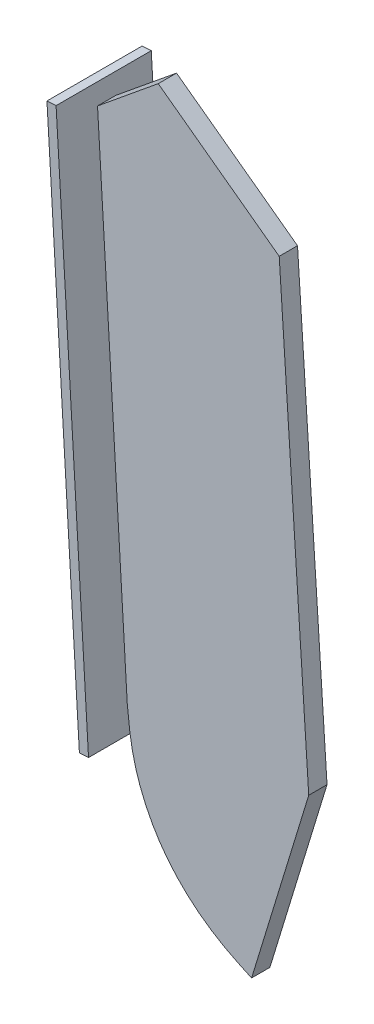
ISO-10303-21;
HEADER;
FILE_DESCRIPTION(('STEP AP214'),'2;1');
FILE_NAME('part.step','',(''),(''),'','','');
FILE_SCHEMA(('AUTOMOTIVE_DESIGN { 1 0 10303 214 1 1 1 1 }'));
ENDSEC;
DATA;
#1=APPLICATION_CONTEXT('core data for automotive mechanical design processes');
#2=APPLICATION_PROTOCOL_DEFINITION('international standard','automotive_design',2000,#1);
#3=PRODUCT_CONTEXT('',#1,'mechanical');
#4=PRODUCT('Part','Part','',(#3));
#5=PRODUCT_RELATED_PRODUCT_CATEGORY('part','',(#4));
#6=PRODUCT_DEFINITION_FORMATION('','',#4);
#7=PRODUCT_DEFINITION_CONTEXT('part definition',#1,'design');
#8=PRODUCT_DEFINITION('design','',#6,#7);
#9=PRODUCT_DEFINITION_SHAPE('','',#8);
#10=(LENGTH_UNIT() NAMED_UNIT(*) SI_UNIT(.MILLI.,.METRE.));
#11=(NAMED_UNIT(*) PLANE_ANGLE_UNIT() SI_UNIT($,.RADIAN.));
#12=(NAMED_UNIT(*) SI_UNIT($,.STERADIAN.) SOLID_ANGLE_UNIT());
#13=UNCERTAINTY_MEASURE_WITH_UNIT(LENGTH_MEASURE(1.E-05),#10,'distance_accuracy_value','');
#14=(GEOMETRIC_REPRESENTATION_CONTEXT(3) GLOBAL_UNCERTAINTY_ASSIGNED_CONTEXT((#13)) GLOBAL_UNIT_ASSIGNED_CONTEXT((#10,
#11,#12)) REPRESENTATION_CONTEXT('',''));
#15=CARTESIAN_POINT('',(0.,0.,0.));
#16=DIRECTION('',(0.,0.,1.));
#17=DIRECTION('',(1.,0.,0.));
#18=AXIS2_PLACEMENT_3D('',#15,#16,#17);
#19=CARTESIAN_POINT('',(-2.99435814981215,-19.6340977838939,0.));
#20=DIRECTION('',(0.,0.,-1.));
#21=DIRECTION('',(-1.,0.,0.));
#22=AXIS2_PLACEMENT_3D('',#19,#20,#21);
#23=PLANE('',#22);
#24=DIRECTION('',(-0.0651979869605493,0.997872347796196,0.));
#25=VECTOR('',#24,1.);
#26=CARTESIAN_POINT('',(7.4080262637328,-18.9544371791575,0.));
#27=LINE('',#26,#25);
#28=CARTESIAN_POINT('',(6.92839376128696,-11.6135355101443,0.));
#29=VERTEX_POINT('',#28);
#30=CARTESIAN_POINT('',(4.99186782849453,18.0255035033314,0.));
#31=VERTEX_POINT('',#30);
#32=EDGE_CURVE('E220',#29,#31,#27,.T.);
#33=ORIENTED_EDGE('',*,*,#32,.F.);
#34=DIRECTION('',(0.292562627041401,0.956246364311329,0.));
#35=VECTOR('',#34,1.);
#36=CARTESIAN_POINT('',(3.8352286118043,-21.7236030820653,0.));
#37=LINE('',#36,#35);
#38=CARTESIAN_POINT('',(3.18015089677821,-23.8647367247269,0.));
#39=VERTEX_POINT('',#38);
#40=EDGE_CURVE('E111',#39,#29,#37,.T.);
#41=ORIENTED_EDGE('',*,*,#40,.F.);
#42=CARTESIAN_POINT('',(-4.97116371564079,-12.3677248434994,0.));
#43=CARTESIAN_POINT('',(-4.9104375920772,-12.986836228571,0.));
#44=CARTESIAN_POINT('',(-4.84967635702795,-13.6059395744976,0.));
#45=CARTESIAN_POINT('',(-4.65454308470152,-14.8272922966131,0.));
#46=CARTESIAN_POINT('',(-4.51801963225564,-15.4290490836025,0.));
#47=CARTESIAN_POINT('',(-4.24283567984022,-16.3155657221554,0.));
#48=CARTESIAN_POINT('',(-4.13915247592688,-16.608333994649,0.));
#49=CARTESIAN_POINT('',(-3.90784814403894,-17.1883896993858,0.));
#50=CARTESIAN_POINT('',(-3.77968372045191,-17.4767605739973,0.));
#51=CARTESIAN_POINT('',(-3.36668629609098,-18.3195399433257,0.));
#52=CARTESIAN_POINT('',(-3.05308792911144,-18.8558737673814,0.));
#53=CARTESIAN_POINT('',(-2.51746792240328,-19.6168793641514,0.));
#54=CARTESIAN_POINT('',(-2.32792866814389,-19.8632127847505,0.));
#55=CARTESIAN_POINT('',(-1.92767848576151,-20.3417607939189,0.));
#56=CARTESIAN_POINT('',(-1.71616765927802,-20.574779067874,0.));
#57=CARTESIAN_POINT('',(-1.05611439654267,-21.2471663901214,0.));
#58=CARTESIAN_POINT('',(-0.586382585309418,-21.6563011055751,0.));
#59=CARTESIAN_POINT('',(0.408094082919773,-22.4020934042176,0.));
#60=CARTESIAN_POINT('',(0.932873324828329,-22.7387056868815,0.));
#61=CARTESIAN_POINT('',(2.03702114271439,-23.3400113404184,0.));
#62=CARTESIAN_POINT('',(2.60865316433103,-23.602856811538,0.));
#63=CARTESIAN_POINT('',(3.18015089677872,-23.8647367247259,0.));
#64=B_SPLINE_CURVE_WITH_KNOTS('',3,(#42,#43,#44,#45,#46,#47,#48,#49,#50,#51,#52,#53,#54,#55,#56,
#57,#58,#59,#60,#61,#62,#63),.UNSPECIFIED.,.F.,.F.,(4,2,2,2,2,2,2,2,2,2,4),(0.,0.125,
0.249999999999999,0.312499999999999,0.375,0.5,0.5625,0.625,0.75,0.875,1.),.UNSPECIFIED.);
#65=CARTESIAN_POINT('',(-4.97116371564079,-12.3677248434994,0.));
#66=VERTEX_POINT('',#65);
#67=EDGE_CURVE('E233',#66,#39,#64,.T.);
#68=ORIENTED_EDGE('',*,*,#67,.F.);
#69=DIRECTION('',(0.0590303717234865,-0.998256187165493,0.));
#70=VECTOR('',#69,1.);
#71=CARTESIAN_POINT('',(-4.53608665860386,-19.7252655704208,0.));
#72=LINE('',#71,#70);
#73=CARTESIAN_POINT('',(-6.92095921815762,20.6050545455971,0.));
#74=VERTEX_POINT('',#73);
#75=EDGE_CURVE('E230',#74,#66,#72,.T.);
#76=ORIENTED_EDGE('',*,*,#75,.F.);
#77=DIRECTION('',(-0.773957299203321,-0.633237790257262,0.));
#78=VECTOR('',#77,1.);
#79=CARTESIAN_POINT('',(-24.290055016919,6.3939761647923,0.));
#80=LINE('',#79,#78);
#81=CARTESIAN_POINT('',(-2.93916536746227,23.8628858779842,0.));
#82=VERTEX_POINT('',#81);
#83=EDGE_CURVE('E227',#82,#74,#80,.T.);
#84=ORIENTED_EDGE('',*,*,#83,.F.);
#85=DIRECTION('',(-0.805372723140072,0.59276873806059,0.));
#86=VECTOR('',#85,1.);
#87=CARTESIAN_POINT('',(17.7904853178753,8.60549197311605,0.));
#88=LINE('',#87,#86);
#89=EDGE_CURVE('E224',#31,#82,#88,.T.);
#90=ORIENTED_EDGE('',*,*,#89,.F.);
#91=EDGE_LOOP('',(#33,#41,#68,#76,#84,#90));
#92=FACE_BOUND('',#91,.T.);
#93=ADVANCED_FACE('F87',(#92),#23,.T.);
#94=CARTESIAN_POINT('',(3.8352286118043,-21.7236030820653,0.));
#95=DIRECTION('',(0.956246364311329,-0.292562627041401,0.));
#96=DIRECTION('',(0.292562627041401,0.956246364311329,0.));
#97=AXIS2_PLACEMENT_3D('',#94,#95,#96);
#98=PLANE('',#97);
#99=DIRECTION('',(0.292562627041401,0.956246364311329,0.));
#100=VECTOR('',#99,1.);
#101=CARTESIAN_POINT('',(3.8352286118043,-21.7236030820653,1.2));
#102=LINE('',#101,#100);
#103=CARTESIAN_POINT('',(3.18015089677821,-23.8647367247269,1.2));
#104=VERTEX_POINT('',#103);
#105=CARTESIAN_POINT('',(6.92839376128696,-11.6135355101443,1.2));
#106=VERTEX_POINT('',#105);
#107=EDGE_CURVE('E216',#104,#106,#102,.T.);
#108=ORIENTED_EDGE('',*,*,#107,.F.);
#109=DIRECTION('',(0.,0.,1.));
#110=VECTOR('',#109,1.);
#111=CARTESIAN_POINT('',(3.18015089677821,-23.8647367247269,0.));
#112=LINE('',#111,#110);
#113=EDGE_CURVE('E12',#39,#104,#112,.T.);
#114=ORIENTED_EDGE('',*,*,#113,.F.);
#115=ORIENTED_EDGE('',*,*,#40,.T.);
#116=DIRECTION('',(0.,0.,1.));
#117=VECTOR('',#116,1.);
#118=CARTESIAN_POINT('',(6.92839376128696,-11.6135355101443,0.));
#119=LINE('',#118,#117);
#120=EDGE_CURVE('E90',#29,#106,#119,.T.);
#121=ORIENTED_EDGE('',*,*,#120,.T.);
#122=EDGE_LOOP('',(#108,#114,#115,#121));
#123=FACE_BOUND('',#122,.T.);
#124=ADVANCED_FACE('F249',(#123),#98,.T.);
#125=DIRECTION('',(0.,0.,1.));
#126=VECTOR('',#125,1.);
#127=SURFACE_OF_LINEAR_EXTRUSION('',#64,#126);
#128=CARTESIAN_POINT('',(-4.97116371564079,-12.3677248434994,1.2));
#129=CARTESIAN_POINT('',(-4.9104375920772,-12.986836228571,1.2));
#130=CARTESIAN_POINT('',(-4.84967635702795,-13.6059395744976,1.2));
#131=CARTESIAN_POINT('',(-4.65454308470152,-14.8272922966131,1.2));
#132=CARTESIAN_POINT('',(-4.51801963225564,-15.4290490836025,1.2));
#133=CARTESIAN_POINT('',(-4.24283567984022,-16.3155657221554,1.2));
#134=CARTESIAN_POINT('',(-4.13915247592688,-16.608333994649,1.2));
#135=CARTESIAN_POINT('',(-3.90784814403894,-17.1883896993858,1.2));
#136=CARTESIAN_POINT('',(-3.77968372045191,-17.4767605739973,1.2));
#137=CARTESIAN_POINT('',(-3.36668629609098,-18.3195399433257,1.2));
#138=CARTESIAN_POINT('',(-3.05308792911144,-18.8558737673814,1.2));
#139=CARTESIAN_POINT('',(-2.51746792240328,-19.6168793641514,1.2));
#140=CARTESIAN_POINT('',(-2.32792866814389,-19.8632127847505,1.2));
#141=CARTESIAN_POINT('',(-1.92767848576151,-20.3417607939189,1.2));
#142=CARTESIAN_POINT('',(-1.71616765927802,-20.574779067874,1.2));
#143=CARTESIAN_POINT('',(-1.05611439654267,-21.2471663901214,1.2));
#144=CARTESIAN_POINT('',(-0.586382585309418,-21.6563011055751,1.2));
#145=CARTESIAN_POINT('',(0.408094082919773,-22.4020934042176,1.2));
#146=CARTESIAN_POINT('',(0.932873324828329,-22.7387056868815,1.2));
#147=CARTESIAN_POINT('',(2.03702114271439,-23.3400113404184,1.2));
#148=CARTESIAN_POINT('',(2.60865316433103,-23.602856811538,1.2));
#149=CARTESIAN_POINT('',(3.18015089677872,-23.8647367247259,1.2));
#150=B_SPLINE_CURVE_WITH_KNOTS('',3,(#128,#129,#130,#131,#132,#133,#134,#135,#136,#137,#138,
#139,#140,#141,#142,#143,#144,#145,#146,#147,#148,#149),.UNSPECIFIED.,.F.,.F.,(4,2,2,2,2,2,2,2,
2,2,4),(0.,0.125,0.249999999999999,0.312499999999999,0.375,0.5,0.5625,0.625,0.75,0.875,1.),.UNSPECIFIED.);
#151=CARTESIAN_POINT('',(-4.97116371564079,-12.3677248434994,1.2));
#152=VERTEX_POINT('',#151);
#153=EDGE_CURVE('E221',#152,#104,#150,.T.);
#154=ORIENTED_EDGE('',*,*,#153,.F.);
#155=DIRECTION('',(0.,0.,1.));
#156=VECTOR('',#155,1.);
#157=CARTESIAN_POINT('',(-4.97116371564079,-12.3677248434994,0.));
#158=LINE('',#157,#156);
#159=EDGE_CURVE('E95',#66,#152,#158,.T.);
#160=ORIENTED_EDGE('',*,*,#159,.F.);
#161=ORIENTED_EDGE('',*,*,#67,.T.);
#162=ORIENTED_EDGE('',*,*,#113,.T.);
#163=EDGE_LOOP('',(#154,#160,#161,#162));
#164=FACE_BOUND('',#163,.T.);
#165=ADVANCED_FACE('F244',(#164),#127,.T.);
#166=CARTESIAN_POINT('',(-4.53608665860386,-19.7252655704208,0.));
#167=DIRECTION('',(-0.998256187165493,-0.0590303717234865,0.));
#168=DIRECTION('',(0.0590303717234865,-0.998256187165493,0.));
#169=AXIS2_PLACEMENT_3D('',#166,#167,#168);
#170=PLANE('',#169);
#171=CARTESIAN_POINT('',(-5.00837517431666,-11.7384459185649,0.600000000000331));
#172=DIRECTION('',(-0.998256187165493,-0.0590303717234865,0.));
#173=DIRECTION('',(0.0590303717234865,-0.998256187165493,0.));
#174=AXIS2_PLACEMENT_3D('',#171,#172,#173);
#175=CIRCLE('',#174,0.300000000000001);
#176=CARTESIAN_POINT('',(-4.99066606279961,-12.0379227747145,0.600000000000331));
#177=VERTEX_POINT('',#176);
#178=EDGE_CURVE('E192',#177,#177,#175,.T.);
#179=ORIENTED_EDGE('',*,*,#178,.F.);
#180=EDGE_LOOP('',(#179));
#181=FACE_BOUND('',#180,.T.);
#182=CARTESIAN_POINT('',(-5.63409711458562,-1.15693033461065,0.600000000000221));
#183=DIRECTION('',(-0.998256187165493,-0.0590303717234865,0.));
#184=DIRECTION('',(0.0590303717234865,-0.998256187165493,0.));
#185=AXIS2_PLACEMENT_3D('',#182,#183,#184);
#186=CIRCLE('',#185,0.300000000000001);
#187=CARTESIAN_POINT('',(-5.61638800306857,-1.4564071907603,0.600000000000221));
#188=VERTEX_POINT('',#187);
#189=EDGE_CURVE('E201',#188,#188,#186,.T.);
#190=ORIENTED_EDGE('',*,*,#189,.F.);
#191=EDGE_LOOP('',(#190));
#192=FACE_BOUND('',#191,.T.);
#193=CARTESIAN_POINT('',(-6.25981905485457,9.42458524934357,0.60000000000011));
#194=DIRECTION('',(-0.998256187165493,-0.0590303717234865,0.));
#195=DIRECTION('',(0.0590303717234865,-0.998256187165493,0.));
#196=AXIS2_PLACEMENT_3D('',#193,#194,#195);
#197=CIRCLE('',#196,0.300000000000001);
#198=CARTESIAN_POINT('',(-6.24210994333753,9.12510839319392,0.60000000000011));
#199=VERTEX_POINT('',#198);
#200=EDGE_CURVE('E207',#199,#199,#197,.T.);
#201=ORIENTED_EDGE('',*,*,#200,.F.);
#202=EDGE_LOOP('',(#201));
#203=FACE_BOUND('',#202,.T.);
#204=CARTESIAN_POINT('',(-6.88554099512353,20.0061008332978,0.6));
#205=DIRECTION('',(-0.998256187165493,-0.0590303717234865,0.));
#206=DIRECTION('',(0.0590303717234865,-0.998256187165493,0.));
#207=AXIS2_PLACEMENT_3D('',#204,#205,#206);
#208=CIRCLE('',#207,0.300000000000002);
#209=CARTESIAN_POINT('',(-6.86783188360648,19.7066239771481,0.6));
#210=VERTEX_POINT('',#209);
#211=EDGE_CURVE('E210',#210,#210,#208,.T.);
#212=ORIENTED_EDGE('',*,*,#211,.F.);
#213=EDGE_LOOP('',(#212));
#214=FACE_BOUND('',#213,.T.);
#215=DIRECTION('',(0.0590303717234865,-0.998256187165493,0.));
#216=VECTOR('',#215,1.);
#217=CARTESIAN_POINT('',(-4.53608665860386,-19.7252655704208,1.2));
#218=LINE('',#217,#216);
#219=CARTESIAN_POINT('',(-6.92095921815762,20.6050545455971,1.2));
#220=VERTEX_POINT('',#219);
#221=EDGE_CURVE('E300',#220,#152,#218,.T.);
#222=ORIENTED_EDGE('',*,*,#221,.F.);
#223=DIRECTION('',(0.,0.,1.));
#224=VECTOR('',#223,1.);
#225=CARTESIAN_POINT('',(-6.92095921815762,20.6050545455971,0.));
#226=LINE('',#225,#224);
#227=EDGE_CURVE('E291',#74,#220,#226,.T.);
#228=ORIENTED_EDGE('',*,*,#227,.F.);
#229=ORIENTED_EDGE('',*,*,#75,.T.);
#230=ORIENTED_EDGE('',*,*,#159,.T.);
#231=EDGE_LOOP('',(#222,#228,#229,#230));
#232=FACE_BOUND('',#231,.T.);
#233=ADVANCED_FACE('F248',(#181,#192,#203,#214,#232),#170,.T.);
#234=CARTESIAN_POINT('',(-24.290055016919,6.3939761647923,0.));
#235=DIRECTION('',(-0.633237790257262,0.773957299203321,0.));
#236=DIRECTION('',(-0.773957299203321,-0.633237790257262,0.));
#237=AXIS2_PLACEMENT_3D('',#234,#235,#236);
#238=PLANE('',#237);
#239=DIRECTION('',(-0.773957299203321,-0.633237790257262,0.));
#240=VECTOR('',#239,1.);
#241=CARTESIAN_POINT('',(-24.290055016919,6.3939761647923,1.2));
#242=LINE('',#241,#240);
#243=CARTESIAN_POINT('',(-2.93916536746227,23.8628858779842,1.2));
#244=VERTEX_POINT('',#243);
#245=EDGE_CURVE('E306',#244,#220,#242,.T.);
#246=ORIENTED_EDGE('',*,*,#245,.F.);
#247=DIRECTION('',(0.,0.,1.));
#248=VECTOR('',#247,1.);
#249=CARTESIAN_POINT('',(-2.93916536746227,23.8628858779842,0.));
#250=LINE('',#249,#248);
#251=EDGE_CURVE('E290',#82,#244,#250,.T.);
#252=ORIENTED_EDGE('',*,*,#251,.F.);
#253=ORIENTED_EDGE('',*,*,#83,.T.);
#254=ORIENTED_EDGE('',*,*,#227,.T.);
#255=EDGE_LOOP('',(#246,#252,#253,#254));
#256=FACE_BOUND('',#255,.T.);
#257=ADVANCED_FACE('F255',(#256),#238,.T.);
#258=CARTESIAN_POINT('',(17.7904853178753,8.60549197311605,0.));
#259=DIRECTION('',(0.59276873806059,0.805372723140072,0.));
#260=DIRECTION('',(-0.805372723140072,0.59276873806059,0.));
#261=AXIS2_PLACEMENT_3D('',#258,#259,#260);
#262=PLANE('',#261);
#263=DIRECTION('',(-0.805372723140072,0.59276873806059,0.));
#264=VECTOR('',#263,1.);
#265=CARTESIAN_POINT('',(17.7904853178753,8.60549197311605,1.2));
#266=LINE('',#265,#264);
#267=CARTESIAN_POINT('',(4.99186782849453,18.0255035033314,1.2));
#268=VERTEX_POINT('',#267);
#269=EDGE_CURVE('E103',#268,#244,#266,.T.);
#270=ORIENTED_EDGE('',*,*,#269,.F.);
#271=DIRECTION('',(0.,0.,1.));
#272=VECTOR('',#271,1.);
#273=CARTESIAN_POINT('',(4.99186782849453,18.0255035033314,0.));
#274=LINE('',#273,#272);
#275=EDGE_CURVE('E286',#31,#268,#274,.T.);
#276=ORIENTED_EDGE('',*,*,#275,.F.);
#277=ORIENTED_EDGE('',*,*,#89,.T.);
#278=ORIENTED_EDGE('',*,*,#251,.T.);
#279=EDGE_LOOP('',(#270,#276,#277,#278));
#280=FACE_BOUND('',#279,.T.);
#281=ADVANCED_FACE('F259',(#280),#262,.T.);
#282=CARTESIAN_POINT('',(7.4080262637328,-18.9544371791575,0.));
#283=DIRECTION('',(0.997872347796196,0.0651979869605493,0.));
#284=DIRECTION('',(-0.0651979869605494,0.997872347796196,0.));
#285=AXIS2_PLACEMENT_3D('',#282,#283,#284);
#286=PLANE('',#285);
#287=DIRECTION('',(-0.0651979869605493,0.997872347796196,0.));
#288=VECTOR('',#287,1.);
#289=CARTESIAN_POINT('',(7.4080262637328,-18.9544371791575,1.2));
#290=LINE('',#289,#288);
#291=EDGE_CURVE('E288',#106,#268,#290,.T.);
#292=ORIENTED_EDGE('',*,*,#291,.F.);
#293=ORIENTED_EDGE('',*,*,#120,.F.);
#294=ORIENTED_EDGE('',*,*,#32,.T.);
#295=ORIENTED_EDGE('',*,*,#275,.T.);
#296=EDGE_LOOP('',(#292,#293,#294,#295));
#297=FACE_BOUND('',#296,.T.);
#298=ADVANCED_FACE('F263',(#297),#286,.T.);
#299=CARTESIAN_POINT('',(-2.99435814981215,-19.6340977838939,1.2));
#300=DIRECTION('',(0.,0.,-1.));
#301=DIRECTION('',(-1.,0.,0.));
#302=AXIS2_PLACEMENT_3D('',#299,#300,#301);
#303=PLANE('',#302);
#304=ORIENTED_EDGE('',*,*,#107,.T.);
#305=ORIENTED_EDGE('',*,*,#291,.T.);
#306=ORIENTED_EDGE('',*,*,#269,.T.);
#307=ORIENTED_EDGE('',*,*,#245,.T.);
#308=ORIENTED_EDGE('',*,*,#221,.T.);
#309=ORIENTED_EDGE('',*,*,#153,.T.);
#310=EDGE_LOOP('',(#304,#305,#306,#307,#308,#309));
#311=FACE_BOUND('',#310,.T.);
#312=ADVANCED_FACE('F266',(#311),#303,.F.);
#313=CARTESIAN_POINT('',(-7.18501785127318,19.9883917217807,0.6));
#314=DIRECTION('',(0.998256187165493,0.0590303717234865,0.));
#315=DIRECTION('',(-0.0590303717234865,0.998256187165493,0.));
#316=AXIS2_PLACEMENT_3D('',#313,#314,#315);
#317=CYLINDRICAL_SURFACE('',#316,0.300000000000002);
#318=CARTESIAN_POINT('',(-7.18501785127318,19.9883917217807,0.6));
#319=DIRECTION('',(-0.998256187165493,-0.0590303717234865,0.));
#320=DIRECTION('',(0.0590303717234865,-0.998256187165493,0.));
#321=AXIS2_PLACEMENT_3D('',#318,#319,#320);
#322=CIRCLE('',#321,0.300000000000002);
#323=CARTESIAN_POINT('',(-7.16730873975613,19.6889148656311,0.6));
#324=VERTEX_POINT('',#323);
#325=EDGE_CURVE('E213',#324,#324,#322,.T.);
#326=ORIENTED_EDGE('',*,*,#325,.F.);
#327=EDGE_LOOP('',(#326));
#328=FACE_BOUND('',#327,.T.);
#329=ORIENTED_EDGE('',*,*,#211,.T.);
#330=EDGE_LOOP('',(#329));
#331=FACE_BOUND('',#330,.T.);
#332=ADVANCED_FACE('F251',(#328,#331),#317,.T.);
#333=CARTESIAN_POINT('',(-6.55929591100422,9.40687613782652,0.60000000000011));
#334=DIRECTION('',(0.998256187165493,0.0590303717234865,0.));
#335=DIRECTION('',(-0.0590303717234865,0.998256187165493,0.));
#336=AXIS2_PLACEMENT_3D('',#333,#334,#335);
#337=CYLINDRICAL_SURFACE('',#336,0.300000000000001);
#338=CARTESIAN_POINT('',(-6.55929591100422,9.40687613782652,0.60000000000011));
#339=DIRECTION('',(-0.998256187165493,-0.0590303717234865,0.));
#340=DIRECTION('',(0.0590303717234865,-0.998256187165493,0.));
#341=AXIS2_PLACEMENT_3D('',#338,#339,#340);
#342=CIRCLE('',#341,0.300000000000001);
#343=CARTESIAN_POINT('',(-6.54158679948717,9.10739928167687,0.60000000000011));
#344=VERTEX_POINT('',#343);
#345=EDGE_CURVE('E204',#344,#344,#342,.T.);
#346=ORIENTED_EDGE('',*,*,#345,.F.);
#347=EDGE_LOOP('',(#346));
#348=FACE_BOUND('',#347,.T.);
#349=ORIENTED_EDGE('',*,*,#200,.T.);
#350=EDGE_LOOP('',(#349));
#351=FACE_BOUND('',#350,.T.);
#352=ADVANCED_FACE('F274',(#348,#351),#337,.T.);
#353=CARTESIAN_POINT('',(-5.93357397073526,-1.1746394461277,0.600000000000221));
#354=DIRECTION('',(0.998256187165493,0.0590303717234865,0.));
#355=DIRECTION('',(-0.0590303717234865,0.998256187165493,0.));
#356=AXIS2_PLACEMENT_3D('',#353,#354,#355);
#357=CYLINDRICAL_SURFACE('',#356,0.300000000000001);
#358=CARTESIAN_POINT('',(-5.93357397073526,-1.1746394461277,0.600000000000221));
#359=DIRECTION('',(-0.998256187165493,-0.0590303717234865,0.));
#360=DIRECTION('',(0.0590303717234865,-0.998256187165493,0.));
#361=AXIS2_PLACEMENT_3D('',#358,#359,#360);
#362=CIRCLE('',#361,0.300000000000001);
#363=CARTESIAN_POINT('',(-5.91586485921822,-1.47411630227735,0.600000000000221));
#364=VERTEX_POINT('',#363);
#365=EDGE_CURVE('E199',#364,#364,#362,.T.);
#366=ORIENTED_EDGE('',*,*,#365,.F.);
#367=EDGE_LOOP('',(#366));
#368=FACE_BOUND('',#367,.T.);
#369=ORIENTED_EDGE('',*,*,#189,.T.);
#370=EDGE_LOOP('',(#369));
#371=FACE_BOUND('',#370,.T.);
#372=ADVANCED_FACE('F383',(#368,#371),#357,.T.);
#373=CARTESIAN_POINT('',(-5.30785203046631,-11.7561550300819,0.600000000000331));
#374=DIRECTION('',(0.998256187165493,0.0590303717234865,0.));
#375=DIRECTION('',(-0.0590303717234865,0.998256187165493,0.));
#376=AXIS2_PLACEMENT_3D('',#373,#374,#375);
#377=CYLINDRICAL_SURFACE('',#376,0.300000000000001);
#378=CARTESIAN_POINT('',(-5.30785203046631,-11.7561550300819,0.600000000000331));
#379=DIRECTION('',(-0.998256187165493,-0.0590303717234865,0.));
#380=DIRECTION('',(0.0590303717234865,-0.998256187165493,0.));
#381=AXIS2_PLACEMENT_3D('',#378,#379,#380);
#382=CIRCLE('',#381,0.300000000000001);
#383=CARTESIAN_POINT('',(-5.29014291894926,-12.0556318862316,0.600000000000331));
#384=VERTEX_POINT('',#383);
#385=EDGE_CURVE('E189',#384,#384,#382,.T.);
#386=ORIENTED_EDGE('',*,*,#385,.F.);
#387=EDGE_LOOP('',(#386));
#388=FACE_BOUND('',#387,.T.);
#389=ORIENTED_EDGE('',*,*,#178,.T.);
#390=EDGE_LOOP('',(#389));
#391=FACE_BOUND('',#390,.T.);
#392=ADVANCED_FACE('F392',(#388,#391),#377,.T.);
#393=CARTESIAN_POINT('',(-7.88059563298337,21.5869726131407,-2.68467914582603));
#394=DIRECTION('',(0.,0.,1.));
#395=DIRECTION('',(1.,0.,0.));
#396=AXIS2_PLACEMENT_3D('',#393,#394,#395);
#397=PLANE('',#396);
#398=DIRECTION('',(0.0590303717234865,-0.998256187165493,0.));
#399=VECTOR('',#398,1.);
#400=CARTESIAN_POINT('',(-7.28164192068407,21.6223908361748,-2.68467914582603));
#401=LINE('',#400,#399);
#402=CARTESIAN_POINT('',(-7.28164192068407,21.6223908361748,-2.68467914582603));
#403=VERTEX_POINT('',#402);
#404=CARTESIAN_POINT('',(-5.15525097437435,-14.3367748697361,-2.68467914582603));
#405=VERTEX_POINT('',#404);
#406=EDGE_CURVE('E188',#403,#405,#401,.T.);
#407=ORIENTED_EDGE('',*,*,#406,.T.);
#408=DIRECTION('',(0.998256187165493,0.0590303717234865,0.));
#409=VECTOR('',#408,1.);
#410=CARTESIAN_POINT('',(-5.75420468667364,-14.3721930927702,-2.68467914582603));
#411=LINE('',#410,#409);
#412=CARTESIAN_POINT('',(-5.75420468667364,-14.3721930927702,-2.68467914582603));
#413=VERTEX_POINT('',#412);
#414=EDGE_CURVE('E168',#413,#405,#411,.T.);
#415=ORIENTED_EDGE('',*,*,#414,.F.);
#416=DIRECTION('',(0.0590303717234865,-0.998256187165493,0.));
#417=VECTOR('',#416,1.);
#418=CARTESIAN_POINT('',(-7.88059563298337,21.5869726131407,-2.68467914582603));
#419=LINE('',#418,#417);
#420=CARTESIAN_POINT('',(-7.88059563298337,21.5869726131407,-2.68467914582603));
#421=VERTEX_POINT('',#420);
#422=EDGE_CURVE('E175',#421,#413,#419,.T.);
#423=ORIENTED_EDGE('',*,*,#422,.F.);
#424=DIRECTION('',(0.998256187165493,0.0590303717234865,0.));
#425=VECTOR('',#424,1.);
#426=CARTESIAN_POINT('',(-7.88059563298337,21.5869726131407,-2.68467914582603));
#427=LINE('',#426,#425);
#428=EDGE_CURVE('E499',#421,#403,#427,.T.);
#429=ORIENTED_EDGE('',*,*,#428,.T.);
#430=EDGE_LOOP('',(#407,#415,#423,#429));
#431=FACE_BOUND('',#430,.T.);
#432=ADVANCED_FACE('F186',(#431),#397,.F.);
#433=CARTESIAN_POINT('',(-5.75420468667364,-14.3721930927702,-2.68467914582603));
#434=DIRECTION('',(-0.0590303717234865,0.998256187165493,0.));
#435=DIRECTION('',(-0.998256187165493,-0.0590303717234865,0.));
#436=AXIS2_PLACEMENT_3D('',#433,#434,#435);
#437=PLANE('',#436);
#438=DIRECTION('',(0.,0.,1.));
#439=VECTOR('',#438,1.);
#440=CARTESIAN_POINT('',(-5.15525097437435,-14.3367748697361,-2.68467914582603));
#441=LINE('',#440,#439);
#442=CARTESIAN_POINT('',(-5.15525097437435,-14.3367748697361,3.55621123124342));
#443=VERTEX_POINT('',#442);
#444=EDGE_CURVE('E490',#405,#443,#441,.T.);
#445=ORIENTED_EDGE('',*,*,#444,.T.);
#446=DIRECTION('',(0.998256187165493,0.0590303717234865,0.));
#447=VECTOR('',#446,1.);
#448=CARTESIAN_POINT('',(-5.75420468667364,-14.3721930927702,3.55621123124342));
#449=LINE('',#448,#447);
#450=CARTESIAN_POINT('',(-5.75420468667364,-14.3721930927702,3.55621123124342));
#451=VERTEX_POINT('',#450);
#452=EDGE_CURVE('E171',#451,#443,#449,.T.);
#453=ORIENTED_EDGE('',*,*,#452,.F.);
#454=DIRECTION('',(0.,0.,1.));
#455=VECTOR('',#454,1.);
#456=CARTESIAN_POINT('',(-5.75420468667364,-14.3721930927702,-2.68467914582603));
#457=LINE('',#456,#455);
#458=EDGE_CURVE('E164',#413,#451,#457,.T.);
#459=ORIENTED_EDGE('',*,*,#458,.F.);
#460=ORIENTED_EDGE('',*,*,#414,.T.);
#461=EDGE_LOOP('',(#445,#453,#459,#460));
#462=FACE_BOUND('',#461,.T.);
#463=ADVANCED_FACE('F166',(#462),#437,.F.);
#464=CARTESIAN_POINT('',(-7.88059563298337,21.5869726131407,3.55621123124342));
#465=DIRECTION('',(0.,0.,-1.));
#466=DIRECTION('',(-1.,0.,0.));
#467=AXIS2_PLACEMENT_3D('',#464,#465,#466);
#468=PLANE('',#467);
#469=DIRECTION('',(-0.0590303717234865,0.998256187165493,0.));
#470=VECTOR('',#469,1.);
#471=CARTESIAN_POINT('',(-7.28164192068407,21.6223908361748,3.55621123124342));
#472=LINE('',#471,#470);
#473=CARTESIAN_POINT('',(-7.28164192068407,21.6223908361748,3.55621123124342));
#474=VERTEX_POINT('',#473);
#475=EDGE_CURVE('E492',#443,#474,#472,.T.);
#476=ORIENTED_EDGE('',*,*,#475,.T.);
#477=DIRECTION('',(0.998256187165493,0.0590303717234865,0.));
#478=VECTOR('',#477,1.);
#479=CARTESIAN_POINT('',(-7.88059563298337,21.5869726131407,3.55621123124342));
#480=LINE('',#479,#478);
#481=CARTESIAN_POINT('',(-7.88059563298337,21.5869726131407,3.55621123124342));
#482=VERTEX_POINT('',#481);
#483=EDGE_CURVE('E194',#482,#474,#480,.T.);
#484=ORIENTED_EDGE('',*,*,#483,.F.);
#485=DIRECTION('',(-0.0590303717234865,0.998256187165493,0.));
#486=VECTOR('',#485,1.);
#487=CARTESIAN_POINT('',(-7.88059563298337,21.5869726131407,3.55621123124342));
#488=LINE('',#487,#486);
#489=EDGE_CURVE('E174',#451,#482,#488,.T.);
#490=ORIENTED_EDGE('',*,*,#489,.F.);
#491=ORIENTED_EDGE('',*,*,#452,.T.);
#492=EDGE_LOOP('',(#476,#484,#490,#491));
#493=FACE_BOUND('',#492,.T.);
#494=ADVANCED_FACE('F419',(#493),#468,.F.);
#495=CARTESIAN_POINT('',(-7.88059563298337,21.5869726131407,-2.68467914582603));
#496=DIRECTION('',(0.0590303717234865,-0.998256187165493,0.));
#497=DIRECTION('',(0.998256187165493,0.0590303717234865,0.));
#498=AXIS2_PLACEMENT_3D('',#495,#496,#497);
#499=PLANE('',#498);
#500=DIRECTION('',(0.,0.,-1.));
#501=VECTOR('',#500,1.);
#502=CARTESIAN_POINT('',(-7.28164192068407,21.6223908361748,-2.68467914582603));
#503=LINE('',#502,#501);
#504=EDGE_CURVE('E184',#474,#403,#503,.T.);
#505=ORIENTED_EDGE('',*,*,#504,.T.);
#506=ORIENTED_EDGE('',*,*,#428,.F.);
#507=DIRECTION('',(0.,0.,-1.));
#508=VECTOR('',#507,1.);
#509=CARTESIAN_POINT('',(-7.88059563298337,21.5869726131407,-2.68467914582603));
#510=LINE('',#509,#508);
#511=EDGE_CURVE('E180',#482,#421,#510,.T.);
#512=ORIENTED_EDGE('',*,*,#511,.F.);
#513=ORIENTED_EDGE('',*,*,#483,.T.);
#514=EDGE_LOOP('',(#505,#506,#512,#513));
#515=FACE_BOUND('',#514,.T.);
#516=ADVANCED_FACE('F428',(#515),#499,.F.);
#517=CARTESIAN_POINT('',(-6.58107012965548,-0.389161641156443,0.));
#518=DIRECTION('',(-0.998256187165493,-0.0590303717234865,0.));
#519=DIRECTION('',(0.0590303717234865,-0.998256187165493,0.));
#520=AXIS2_PLACEMENT_3D('',#517,#518,#519);
#521=PLANE('',#520);
#522=ORIENTED_EDGE('',*,*,#422,.T.);
#523=ORIENTED_EDGE('',*,*,#458,.T.);
#524=ORIENTED_EDGE('',*,*,#489,.T.);
#525=ORIENTED_EDGE('',*,*,#511,.T.);
#526=EDGE_LOOP('',(#522,#523,#524,#525));
#527=FACE_BOUND('',#526,.T.);
#528=ADVANCED_FACE('F178',(#527),#521,.T.);
#529=CARTESIAN_POINT('',(-5.98211641735619,-0.353743418122352,0.));
#530=DIRECTION('',(-0.998256187165493,-0.0590303717234865,0.));
#531=DIRECTION('',(0.0590303717234865,-0.998256187165493,0.));
#532=AXIS2_PLACEMENT_3D('',#529,#530,#531);
#533=PLANE('',#532);
#534=ORIENTED_EDGE('',*,*,#325,.T.);
#535=EDGE_LOOP('',(#534));
#536=FACE_BOUND('',#535,.T.);
#537=ORIENTED_EDGE('',*,*,#345,.T.);
#538=EDGE_LOOP('',(#537));
#539=FACE_BOUND('',#538,.T.);
#540=ORIENTED_EDGE('',*,*,#365,.T.);
#541=EDGE_LOOP('',(#540));
#542=FACE_BOUND('',#541,.T.);
#543=ORIENTED_EDGE('',*,*,#385,.T.);
#544=EDGE_LOOP('',(#543));
#545=FACE_BOUND('',#544,.T.);
#546=ORIENTED_EDGE('',*,*,#406,.F.);
#547=ORIENTED_EDGE('',*,*,#504,.F.);
#548=ORIENTED_EDGE('',*,*,#475,.F.);
#549=ORIENTED_EDGE('',*,*,#444,.F.);
#550=EDGE_LOOP('',(#546,#547,#548,#549));
#551=FACE_BOUND('',#550,.T.);
#552=ADVANCED_FACE('F447',(#536,#539,#542,#545,#551),#533,.F.);
#553=CLOSED_SHELL('',(#93,#124,#165,#233,#257,#281,#298,#312,#332,#352,#372,#392,#432,#463,#494,
#516,#528,#552));
#554=MANIFOLD_SOLID_BREP('B2',#553);
#555=ADVANCED_BREP_SHAPE_REPRESENTATION('',(#18,#554),#14);
#556=SHAPE_DEFINITION_REPRESENTATION(#9,#555);
ENDSEC;
END-ISO-10303-21;
